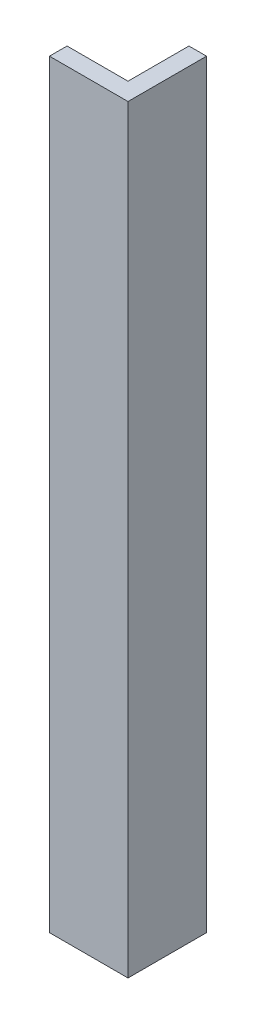
ISO-10303-21;
HEADER;
FILE_DESCRIPTION(('STEP AP214'),'2;1');
FILE_NAME('part.step','',(''),(''),'','','');
FILE_SCHEMA(('AUTOMOTIVE_DESIGN { 1 0 10303 214 1 1 1 1 }'));
ENDSEC;
DATA;
#1=APPLICATION_CONTEXT('core data for automotive mechanical design processes');
#2=APPLICATION_PROTOCOL_DEFINITION('international standard','automotive_design',2000,#1);
#3=PRODUCT_CONTEXT('',#1,'mechanical');
#4=PRODUCT('Part','Part','',(#3));
#5=PRODUCT_RELATED_PRODUCT_CATEGORY('part','',(#4));
#6=PRODUCT_DEFINITION_FORMATION('','',#4);
#7=PRODUCT_DEFINITION_CONTEXT('part definition',#1,'design');
#8=PRODUCT_DEFINITION('design','',#6,#7);
#9=PRODUCT_DEFINITION_SHAPE('','',#8);
#10=(LENGTH_UNIT() NAMED_UNIT(*) SI_UNIT(.MILLI.,.METRE.));
#11=(NAMED_UNIT(*) PLANE_ANGLE_UNIT() SI_UNIT($,.RADIAN.));
#12=(NAMED_UNIT(*) SI_UNIT($,.STERADIAN.) SOLID_ANGLE_UNIT());
#13=UNCERTAINTY_MEASURE_WITH_UNIT(LENGTH_MEASURE(1.E-05),#10,'distance_accuracy_value','');
#14=(GEOMETRIC_REPRESENTATION_CONTEXT(3) GLOBAL_UNCERTAINTY_ASSIGNED_CONTEXT((#13)) GLOBAL_UNIT_ASSIGNED_CONTEXT((#10,
#11,#12)) REPRESENTATION_CONTEXT('',''));
#15=CARTESIAN_POINT('',(0.,0.,0.));
#16=DIRECTION('',(0.,0.,1.));
#17=DIRECTION('',(1.,0.,0.));
#18=AXIS2_PLACEMENT_3D('',#15,#16,#17);
#19=CARTESIAN_POINT('',(-3.17500000000001,157.046477246639,-3.17500000000001));
#20=DIRECTION('',(-1.,0.,0.));
#21=DIRECTION('',(0.,0.,1.));
#22=AXIS2_PLACEMENT_3D('',#19,#20,#21);
#23=PLANE('',#22);
#24=DIRECTION('',(0.,-1.,0.));
#25=VECTOR('',#24,1.);
#26=CARTESIAN_POINT('',(-3.17500000000001,157.046477246639,-3.17500000000001));
#27=LINE('',#26,#25);
#28=CARTESIAN_POINT('',(-3.17500000000001,137.,-3.17500000000001));
#29=VERTEX_POINT('',#28);
#30=CARTESIAN_POINT('',(-3.17500000000001,0.,-3.17500000000001));
#31=VERTEX_POINT('',#30);
#32=EDGE_CURVE('E125',#29,#31,#27,.T.);
#33=ORIENTED_EDGE('',*,*,#32,.F.);
#34=DIRECTION('',(0.,0.,-1.));
#35=VECTOR('',#34,1.);
#36=CARTESIAN_POINT('',(-3.17500000000001,137.,-3.17500000000001));
#37=LINE('',#36,#35);
#38=CARTESIAN_POINT('',(-3.175,137.,-14.175));
#39=VERTEX_POINT('',#38);
#40=EDGE_CURVE('E123',#29,#39,#37,.T.);
#41=ORIENTED_EDGE('',*,*,#40,.T.);
#42=DIRECTION('',(0.,-1.,0.));
#43=VECTOR('',#42,1.);
#44=CARTESIAN_POINT('',(-3.175,157.046477246639,-14.175));
#45=LINE('',#44,#43);
#46=CARTESIAN_POINT('',(-3.175,0.,-14.175));
#47=VERTEX_POINT('',#46);
#48=EDGE_CURVE('E37',#39,#47,#45,.T.);
#49=ORIENTED_EDGE('',*,*,#48,.T.);
#50=DIRECTION('',(0.,0.,-1.));
#51=VECTOR('',#50,1.);
#52=CARTESIAN_POINT('',(-3.17500000000001,0.,-3.17500000000001));
#53=LINE('',#52,#51);
#54=EDGE_CURVE('E116',#31,#47,#53,.T.);
#55=ORIENTED_EDGE('',*,*,#54,.F.);
#56=EDGE_LOOP('',(#33,#41,#49,#55));
#57=FACE_BOUND('',#56,.T.);
#58=ADVANCED_FACE('F33',(#57),#23,.T.);
#59=CARTESIAN_POINT('',(-3.17500000000001,157.046477246639,-3.17500000000001));
#60=DIRECTION('',(0.,0.,1.));
#61=DIRECTION('',(1.,0.,0.));
#62=AXIS2_PLACEMENT_3D('',#59,#60,#61);
#63=PLANE('',#62);
#64=DIRECTION('',(-1.,0.,0.));
#65=VECTOR('',#64,1.);
#66=CARTESIAN_POINT('',(-3.17500000000001,137.,-3.17500000000001));
#67=LINE('',#66,#65);
#68=CARTESIAN_POINT('',(-14.175,137.,-3.175));
#69=VERTEX_POINT('',#68);
#70=EDGE_CURVE('E72',#29,#69,#67,.T.);
#71=ORIENTED_EDGE('',*,*,#70,.F.);
#72=ORIENTED_EDGE('',*,*,#32,.T.);
#73=DIRECTION('',(-1.,0.,0.));
#74=VECTOR('',#73,1.);
#75=CARTESIAN_POINT('',(-3.17500000000001,0.,-3.17500000000001));
#76=LINE('',#75,#74);
#77=CARTESIAN_POINT('',(-14.175,0.,-3.175));
#78=VERTEX_POINT('',#77);
#79=EDGE_CURVE('E127',#31,#78,#76,.T.);
#80=ORIENTED_EDGE('',*,*,#79,.T.);
#81=DIRECTION('',(0.,-1.,0.));
#82=VECTOR('',#81,1.);
#83=CARTESIAN_POINT('',(-14.175,157.046477246639,-3.175));
#84=LINE('',#83,#82);
#85=EDGE_CURVE('E128',#69,#78,#84,.T.);
#86=ORIENTED_EDGE('',*,*,#85,.F.);
#87=EDGE_LOOP('',(#71,#72,#80,#86));
#88=FACE_BOUND('',#87,.T.);
#89=ADVANCED_FACE('F142',(#88),#63,.F.);
#90=CARTESIAN_POINT('',(-14.175,157.046477246639,-3.175));
#91=DIRECTION('',(1.,0.,0.));
#92=DIRECTION('',(0.,0.,-1.));
#93=AXIS2_PLACEMENT_3D('',#90,#91,#92);
#94=PLANE('',#93);
#95=DIRECTION('',(0.,0.,1.));
#96=VECTOR('',#95,1.);
#97=CARTESIAN_POINT('',(-14.175,137.,-3.175));
#98=LINE('',#97,#96);
#99=CARTESIAN_POINT('',(-14.175,137.,0.));
#100=VERTEX_POINT('',#99);
#101=EDGE_CURVE('E42',#69,#100,#98,.T.);
#102=ORIENTED_EDGE('',*,*,#101,.F.);
#103=ORIENTED_EDGE('',*,*,#85,.T.);
#104=DIRECTION('',(0.,0.,1.));
#105=VECTOR('',#104,1.);
#106=CARTESIAN_POINT('',(-14.175,0.,-3.175));
#107=LINE('',#106,#105);
#108=CARTESIAN_POINT('',(-14.175,0.,0.));
#109=VERTEX_POINT('',#108);
#110=EDGE_CURVE('E119',#78,#109,#107,.T.);
#111=ORIENTED_EDGE('',*,*,#110,.T.);
#112=DIRECTION('',(0.,-1.,0.));
#113=VECTOR('',#112,1.);
#114=CARTESIAN_POINT('',(-14.175,157.046477246639,0.));
#115=LINE('',#114,#113);
#116=EDGE_CURVE('E93',#100,#109,#115,.T.);
#117=ORIENTED_EDGE('',*,*,#116,.F.);
#118=EDGE_LOOP('',(#102,#103,#111,#117));
#119=FACE_BOUND('',#118,.T.);
#120=ADVANCED_FACE('F141',(#119),#94,.F.);
#121=CARTESIAN_POINT('',(0.,157.046477246639,0.));
#122=DIRECTION('',(0.,0.,1.));
#123=DIRECTION('',(1.,0.,0.));
#124=AXIS2_PLACEMENT_3D('',#121,#122,#123);
#125=PLANE('',#124);
#126=DIRECTION('',(0.,-1.,0.));
#127=VECTOR('',#126,1.);
#128=CARTESIAN_POINT('',(0.,157.046477246639,0.));
#129=LINE('',#128,#127);
#130=CARTESIAN_POINT('',(0.,137.,0.));
#131=VERTEX_POINT('',#130);
#132=CARTESIAN_POINT('',(0.,0.,0.));
#133=VERTEX_POINT('',#132);
#134=EDGE_CURVE('E104',#131,#133,#129,.T.);
#135=ORIENTED_EDGE('',*,*,#134,.F.);
#136=DIRECTION('',(-1.,0.,0.));
#137=VECTOR('',#136,1.);
#138=CARTESIAN_POINT('',(0.,137.,0.));
#139=LINE('',#138,#137);
#140=EDGE_CURVE('E110',#131,#100,#139,.T.);
#141=ORIENTED_EDGE('',*,*,#140,.T.);
#142=ORIENTED_EDGE('',*,*,#116,.T.);
#143=DIRECTION('',(-1.,0.,0.));
#144=VECTOR('',#143,1.);
#145=CARTESIAN_POINT('',(0.,0.,0.));
#146=LINE('',#145,#144);
#147=EDGE_CURVE('E122',#133,#109,#146,.T.);
#148=ORIENTED_EDGE('',*,*,#147,.F.);
#149=EDGE_LOOP('',(#135,#141,#142,#148));
#150=FACE_BOUND('',#149,.T.);
#151=ADVANCED_FACE('F149',(#150),#125,.T.);
#152=CARTESIAN_POINT('',(0.,157.046477246639,-14.175));
#153=DIRECTION('',(1.,0.,0.));
#154=DIRECTION('',(0.,0.,-1.));
#155=AXIS2_PLACEMENT_3D('',#152,#153,#154);
#156=PLANE('',#155);
#157=DIRECTION('',(0.,-1.,0.));
#158=VECTOR('',#157,1.);
#159=CARTESIAN_POINT('',(0.,157.046477246639,-14.175));
#160=LINE('',#159,#158);
#161=CARTESIAN_POINT('',(0.,137.,-14.175));
#162=VERTEX_POINT('',#161);
#163=CARTESIAN_POINT('',(0.,0.,-14.175));
#164=VERTEX_POINT('',#163);
#165=EDGE_CURVE('E55',#162,#164,#160,.T.);
#166=ORIENTED_EDGE('',*,*,#165,.F.);
#167=DIRECTION('',(0.,0.,1.));
#168=VECTOR('',#167,1.);
#169=CARTESIAN_POINT('',(0.,137.,-14.175));
#170=LINE('',#169,#168);
#171=EDGE_CURVE('E99',#162,#131,#170,.T.);
#172=ORIENTED_EDGE('',*,*,#171,.T.);
#173=ORIENTED_EDGE('',*,*,#134,.T.);
#174=DIRECTION('',(0.,0.,1.));
#175=VECTOR('',#174,1.);
#176=CARTESIAN_POINT('',(0.,0.,-14.175));
#177=LINE('',#176,#175);
#178=EDGE_CURVE('E102',#164,#133,#177,.T.);
#179=ORIENTED_EDGE('',*,*,#178,.F.);
#180=EDGE_LOOP('',(#166,#172,#173,#179));
#181=FACE_BOUND('',#180,.T.);
#182=ADVANCED_FACE('F97',(#181),#156,.T.);
#183=CARTESIAN_POINT('',(0.,157.046477246639,-14.175));
#184=DIRECTION('',(0.,0.,1.));
#185=DIRECTION('',(1.,0.,0.));
#186=AXIS2_PLACEMENT_3D('',#183,#184,#185);
#187=PLANE('',#186);
#188=DIRECTION('',(-1.,0.,0.));
#189=VECTOR('',#188,1.);
#190=CARTESIAN_POINT('',(0.,137.,-14.175));
#191=LINE('',#190,#189);
#192=EDGE_CURVE('E11',#162,#39,#191,.T.);
#193=ORIENTED_EDGE('',*,*,#192,.F.);
#194=ORIENTED_EDGE('',*,*,#165,.T.);
#195=DIRECTION('',(-1.,0.,0.));
#196=VECTOR('',#195,1.);
#197=CARTESIAN_POINT('',(0.,0.,-14.175));
#198=LINE('',#197,#196);
#199=EDGE_CURVE('E103',#164,#47,#198,.T.);
#200=ORIENTED_EDGE('',*,*,#199,.T.);
#201=ORIENTED_EDGE('',*,*,#48,.F.);
#202=EDGE_LOOP('',(#193,#194,#200,#201));
#203=FACE_BOUND('',#202,.T.);
#204=ADVANCED_FACE('F105',(#203),#187,.F.);
#205=CARTESIAN_POINT('',(0.,0.,0.));
#206=DIRECTION('',(0.,1.,0.));
#207=DIRECTION('',(0.,0.,1.));
#208=AXIS2_PLACEMENT_3D('',#205,#206,#207);
#209=PLANE('',#208);
#210=ORIENTED_EDGE('',*,*,#54,.T.);
#211=ORIENTED_EDGE('',*,*,#199,.F.);
#212=ORIENTED_EDGE('',*,*,#178,.T.);
#213=ORIENTED_EDGE('',*,*,#147,.T.);
#214=ORIENTED_EDGE('',*,*,#110,.F.);
#215=ORIENTED_EDGE('',*,*,#79,.F.);
#216=EDGE_LOOP('',(#210,#211,#212,#213,#214,#215));
#217=FACE_BOUND('',#216,.T.);
#218=ADVANCED_FACE('F140',(#217),#209,.F.);
#219=CARTESIAN_POINT('',(-184.534207094308,137.,-38.1749999999999));
#220=DIRECTION('',(0.,1.,0.));
#221=DIRECTION('',(0.,0.,-1.));
#222=AXIS2_PLACEMENT_3D('',#219,#220,#221);
#223=PLANE('',#222);
#224=ORIENTED_EDGE('',*,*,#40,.F.);
#225=ORIENTED_EDGE('',*,*,#70,.T.);
#226=ORIENTED_EDGE('',*,*,#101,.T.);
#227=ORIENTED_EDGE('',*,*,#140,.F.);
#228=ORIENTED_EDGE('',*,*,#171,.F.);
#229=ORIENTED_EDGE('',*,*,#192,.T.);
#230=EDGE_LOOP('',(#224,#225,#226,#227,#228,#229));
#231=FACE_BOUND('',#230,.T.);
#232=ADVANCED_FACE('F35',(#231),#223,.T.);
#233=CLOSED_SHELL('',(#58,#89,#120,#151,#182,#204,#218,#232));
#234=MANIFOLD_SOLID_BREP('B2',#233);
#235=ADVANCED_BREP_SHAPE_REPRESENTATION('',(#18,#234),#14);
#236=SHAPE_DEFINITION_REPRESENTATION(#9,#235);
ENDSEC;
END-ISO-10303-21;
